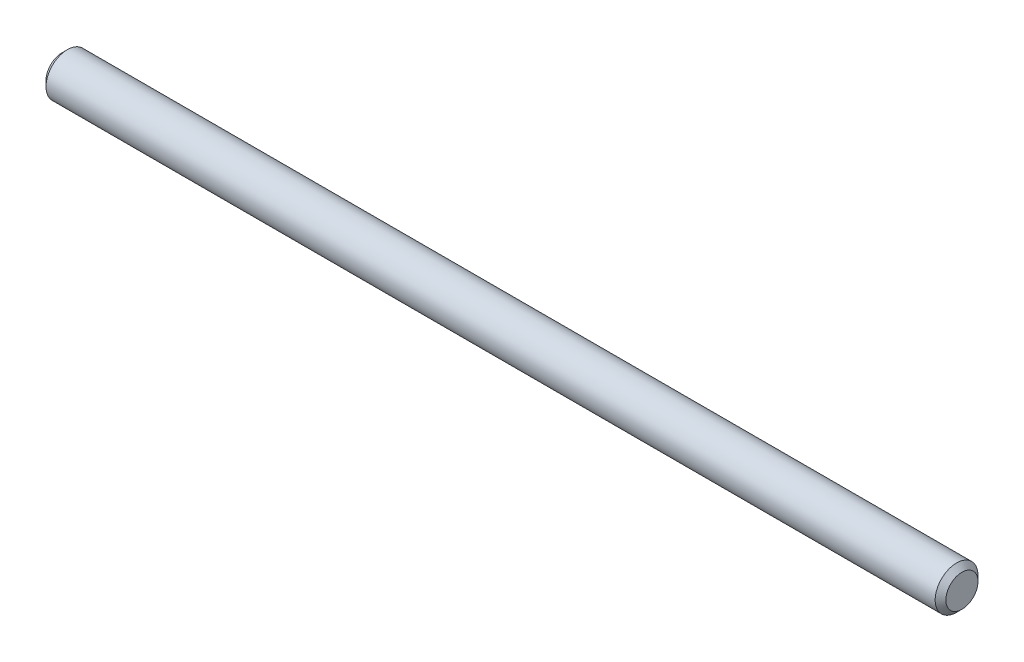
ISO-10303-21;
HEADER;
FILE_DESCRIPTION(('STEP AP214'),'2;1');
FILE_NAME('part.step','',(''),(''),'','','');
FILE_SCHEMA(('AUTOMOTIVE_DESIGN { 1 0 10303 214 1 1 1 1 }'));
ENDSEC;
DATA;
#1=APPLICATION_CONTEXT('core data for automotive mechanical design processes');
#2=APPLICATION_PROTOCOL_DEFINITION('international standard','automotive_design',2000,#1);
#3=PRODUCT_CONTEXT('',#1,'mechanical');
#4=PRODUCT('Part','Part','',(#3));
#5=PRODUCT_RELATED_PRODUCT_CATEGORY('part','',(#4));
#6=PRODUCT_DEFINITION_FORMATION('','',#4);
#7=PRODUCT_DEFINITION_CONTEXT('part definition',#1,'design');
#8=PRODUCT_DEFINITION('design','',#6,#7);
#9=PRODUCT_DEFINITION_SHAPE('','',#8);
#10=(LENGTH_UNIT() NAMED_UNIT(*) SI_UNIT(.MILLI.,.METRE.));
#11=(NAMED_UNIT(*) PLANE_ANGLE_UNIT() SI_UNIT($,.RADIAN.));
#12=(NAMED_UNIT(*) SI_UNIT($,.STERADIAN.) SOLID_ANGLE_UNIT());
#13=UNCERTAINTY_MEASURE_WITH_UNIT(LENGTH_MEASURE(1.E-05),#10,'distance_accuracy_value','');
#14=(GEOMETRIC_REPRESENTATION_CONTEXT(3) GLOBAL_UNCERTAINTY_ASSIGNED_CONTEXT((#13)) GLOBAL_UNIT_ASSIGNED_CONTEXT((#10,
#11,#12)) REPRESENTATION_CONTEXT('',''));
#15=CARTESIAN_POINT('',(0.,0.,0.));
#16=DIRECTION('',(0.,0.,1.));
#17=DIRECTION('',(1.,0.,0.));
#18=AXIS2_PLACEMENT_3D('',#15,#16,#17);
#19=CARTESIAN_POINT('',(42.,0.,0.));
#20=DIRECTION('',(-1.,0.,0.));
#21=DIRECTION('',(0.,0.,1.));
#22=AXIS2_PLACEMENT_3D('',#19,#20,#21);
#23=CYLINDRICAL_SURFACE('',#22,2.);
#24=CARTESIAN_POINT('',(41.5,0.,0.));
#25=DIRECTION('',(1.,0.,0.));
#26=DIRECTION('',(0.,0.,-1.));
#27=AXIS2_PLACEMENT_3D('',#24,#25,#26);
#28=CIRCLE('',#27,2.);
#29=CARTESIAN_POINT('',(41.5,0.,2.));
#30=VERTEX_POINT('',#29);
#31=EDGE_CURVE('E42',#30,#30,#28,.F.);
#32=CARTESIAN_POINT('',(-41.4999999999999,0.,0.));
#33=DIRECTION('',(1.,0.,0.));
#34=DIRECTION('',(0.,0.,-1.));
#35=AXIS2_PLACEMENT_3D('',#32,#33,#34);
#36=CIRCLE('',#35,2.);
#37=CARTESIAN_POINT('',(-41.4999999999999,0.,2.));
#38=VERTEX_POINT('',#37);
#39=EDGE_CURVE('E46',#38,#38,#36,.T.);
#40=CARTESIAN_POINT('',(41.5,0.,2.));
#41=CARTESIAN_POINT('',(40.6354166666667,0.,2.));
#42=CARTESIAN_POINT('',(39.7708333333334,0.,2.));
#43=CARTESIAN_POINT('',(38.0416666666667,0.,2.));
#44=CARTESIAN_POINT('',(37.1770833333334,0.,2.));
#45=CARTESIAN_POINT('',(35.4479166666667,0.,2.));
#46=CARTESIAN_POINT('',(34.5833333333334,0.,2.));
#47=CARTESIAN_POINT('',(32.8541666666667,0.,2.));
#48=CARTESIAN_POINT('',(31.9895833333334,0.,2.));
#49=CARTESIAN_POINT('',(30.2604166666667,0.,2.));
#50=CARTESIAN_POINT('',(29.3958333333334,0.,2.));
#51=CARTESIAN_POINT('',(27.6666666666667,0.,2.));
#52=CARTESIAN_POINT('',(26.8020833333334,0.,2.));
#53=CARTESIAN_POINT('',(25.0729166666667,0.,2.));
#54=CARTESIAN_POINT('',(24.2083333333334,0.,2.));
#55=CARTESIAN_POINT('',(22.4791666666667,0.,2.));
#56=CARTESIAN_POINT('',(21.6145833333334,0.,2.));
#57=CARTESIAN_POINT('',(19.8854166666667,0.,2.));
#58=CARTESIAN_POINT('',(19.0208333333334,0.,2.));
#59=CARTESIAN_POINT('',(17.2916666666667,0.,2.));
#60=CARTESIAN_POINT('',(16.4270833333334,0.,2.));
#61=CARTESIAN_POINT('',(14.6979166666667,0.,2.));
#62=CARTESIAN_POINT('',(13.8333333333334,0.,2.));
#63=CARTESIAN_POINT('',(12.1041666666667,0.,2.));
#64=CARTESIAN_POINT('',(11.2395833333334,0.,2.));
#65=CARTESIAN_POINT('',(9.5104166666667,0.,2.));
#66=CARTESIAN_POINT('',(8.64583333333337,0.,2.));
#67=CARTESIAN_POINT('',(6.9166666666667,0.,2.));
#68=CARTESIAN_POINT('',(6.05208333333337,0.,2.));
#69=CARTESIAN_POINT('',(4.3229166666667,0.,2.));
#70=CARTESIAN_POINT('',(3.45833333333337,0.,2.));
#71=CARTESIAN_POINT('',(1.7291666666667,0.,2.));
#72=CARTESIAN_POINT('',(0.864583333333372,0.,2.));
#73=CARTESIAN_POINT('',(-0.864583333333294,0.,2.));
#74=CARTESIAN_POINT('',(-1.72916666666663,0.,2.));
#75=CARTESIAN_POINT('',(-3.45833333333329,0.,2.));
#76=CARTESIAN_POINT('',(-4.32291666666663,0.,2.));
#77=CARTESIAN_POINT('',(-6.05208333333329,0.,2.));
#78=CARTESIAN_POINT('',(-6.91666666666663,0.,2.));
#79=CARTESIAN_POINT('',(-8.64583333333329,0.,2.));
#80=CARTESIAN_POINT('',(-9.51041666666662,0.,2.));
#81=CARTESIAN_POINT('',(-11.2395833333333,0.,2.));
#82=CARTESIAN_POINT('',(-12.1041666666666,0.,2.));
#83=CARTESIAN_POINT('',(-13.8333333333333,0.,2.));
#84=CARTESIAN_POINT('',(-14.6979166666666,0.,2.));
#85=CARTESIAN_POINT('',(-16.4270833333333,0.,2.));
#86=CARTESIAN_POINT('',(-17.2916666666666,0.,2.));
#87=CARTESIAN_POINT('',(-19.0208333333333,0.,2.));
#88=CARTESIAN_POINT('',(-19.8854166666666,0.,2.));
#89=CARTESIAN_POINT('',(-21.6145833333333,0.,2.));
#90=CARTESIAN_POINT('',(-22.4791666666666,0.,2.));
#91=CARTESIAN_POINT('',(-24.2083333333333,0.,2.));
#92=CARTESIAN_POINT('',(-25.0729166666666,0.,2.));
#93=CARTESIAN_POINT('',(-26.8020833333333,0.,2.));
#94=CARTESIAN_POINT('',(-27.6666666666666,0.,2.));
#95=CARTESIAN_POINT('',(-29.3958333333333,0.,2.));
#96=CARTESIAN_POINT('',(-30.2604166666666,0.,2.));
#97=CARTESIAN_POINT('',(-31.9895833333333,0.,2.));
#98=CARTESIAN_POINT('',(-32.8541666666666,0.,2.));
#99=CARTESIAN_POINT('',(-34.5833333333333,0.,2.));
#100=CARTESIAN_POINT('',(-35.4479166666666,0.,2.));
#101=CARTESIAN_POINT('',(-37.1770833333333,0.,2.));
#102=CARTESIAN_POINT('',(-38.0416666666666,0.,2.));
#103=CARTESIAN_POINT('',(-39.7708333333333,0.,2.));
#104=CARTESIAN_POINT('',(-40.6354166666666,0.,2.));
#105=CARTESIAN_POINT('',(-41.4999999999999,0.,2.));
#106=B_SPLINE_CURVE_WITH_KNOTS('',3,(#40,#41,#42,#43,#44,#45,#46,#47,#48,#49,#50,#51,#52,#53,
#54,#55,#56,#57,#58,#59,#60,#61,#62,#63,#64,#65,#66,#67,#68,#69,#70,#71,#72,#73,#74,#75,#76,#77,
#78,#79,#80,#81,#82,#83,#84,#85,#86,#87,#88,#89,#90,#91,#92,#93,#94,#95,#96,#97,#98,#99,#100,
#101,#102,#103,#104,#105),.UNSPECIFIED.,.F.,.F.,(4,2,2,2,2,2,2,2,2,2,2,2,2,2,2,2,2,2,2,2,2,2,2,
2,2,2,2,2,2,2,2,2,4),(0.,2.59375000000001,5.1875,7.78125,10.375,12.96875,15.5625,18.15625,20.75,
23.34375,25.9375,28.53125,31.125,33.71875,36.3125,38.90625,41.5,44.09375,46.6875,49.28125,
51.875,54.46875,57.0625,59.65625,62.25,64.84375,67.4375,70.03125,72.625,75.21875,77.8125,
80.40625,83.),.UNSPECIFIED.);
#107=EDGE_CURVE('BSEAM35',#30,#38,#106,.T.);
#108=ORIENTED_EDGE('',*,*,#31,.T.);
#109=ORIENTED_EDGE('',*,*,#39,.T.);
#110=ORIENTED_EDGE('',*,*,#107,.T.);
#111=ORIENTED_EDGE('',*,*,#107,.F.);
#112=EDGE_LOOP('',(#108,#110,#109,#111));
#113=FACE_BOUND('',#112,.T.);
#114=ADVANCED_FACE('F35',(#113),#23,.T.);
#115=CARTESIAN_POINT('',(42.,0.,0.));
#116=DIRECTION('',(1.,0.,0.));
#117=DIRECTION('',(0.,0.,-1.));
#118=AXIS2_PLACEMENT_3D('',#115,#116,#117);
#119=PLANE('',#118);
#120=CARTESIAN_POINT('',(42.,0.,0.));
#121=DIRECTION('',(1.,0.,0.));
#122=DIRECTION('',(0.,0.,-1.));
#123=AXIS2_PLACEMENT_3D('',#120,#121,#122);
#124=CIRCLE('',#123,1.50000000000003);
#125=CARTESIAN_POINT('',(42.,0.,-1.50000000000003));
#126=VERTEX_POINT('',#125);
#127=EDGE_CURVE('E50',#126,#126,#124,.T.);
#128=ORIENTED_EDGE('',*,*,#127,.T.);
#129=EDGE_LOOP('',(#128));
#130=FACE_BOUND('',#129,.T.);
#131=ADVANCED_FACE('F56',(#130),#119,.T.);
#132=CARTESIAN_POINT('',(-42.,0.,0.));
#133=DIRECTION('',(1.,0.,0.));
#134=DIRECTION('',(0.,0.,-1.));
#135=AXIS2_PLACEMENT_3D('',#132,#133,#134);
#136=PLANE('',#135);
#137=CARTESIAN_POINT('',(-42.,0.,0.));
#138=DIRECTION('',(1.,0.,0.));
#139=DIRECTION('',(0.,0.,-1.));
#140=AXIS2_PLACEMENT_3D('',#137,#138,#139);
#141=CIRCLE('',#140,1.49999999999992);
#142=CARTESIAN_POINT('',(-42.,0.,-1.49999999999992));
#143=VERTEX_POINT('',#142);
#144=EDGE_CURVE('E10',#143,#143,#141,.F.);
#145=ORIENTED_EDGE('',*,*,#144,.T.);
#146=EDGE_LOOP('',(#145));
#147=FACE_BOUND('',#146,.T.);
#148=ADVANCED_FACE('F60',(#147),#136,.F.);
#149=CARTESIAN_POINT('',(42.,0.,0.));
#150=DIRECTION('',(-1.,0.,0.));
#151=DIRECTION('',(0.,0.,1.));
#152=AXIS2_PLACEMENT_3D('',#149,#150,#151);
#153=CONICAL_SURFACE('',#152,1.50000000000003,0.785398163397449);
#154=ORIENTED_EDGE('',*,*,#31,.F.);
#155=EDGE_LOOP('',(#154));
#156=FACE_BOUND('',#155,.T.);
#157=ORIENTED_EDGE('',*,*,#127,.F.);
#158=EDGE_LOOP('',(#157));
#159=FACE_BOUND('',#158,.T.);
#160=ADVANCED_FACE('F58',(#156,#159),#153,.T.);
#161=CARTESIAN_POINT('',(-41.4999999999999,0.,0.));
#162=DIRECTION('',(1.,0.,0.));
#163=DIRECTION('',(0.,0.,-1.));
#164=AXIS2_PLACEMENT_3D('',#161,#162,#163);
#165=CONICAL_SURFACE('',#164,2.,0.785398163397456);
#166=ORIENTED_EDGE('',*,*,#144,.F.);
#167=EDGE_LOOP('',(#166));
#168=FACE_BOUND('',#167,.T.);
#169=ORIENTED_EDGE('',*,*,#39,.F.);
#170=EDGE_LOOP('',(#169));
#171=FACE_BOUND('',#170,.T.);
#172=ADVANCED_FACE('F37',(#168,#171),#165,.T.);
#173=CLOSED_SHELL('',(#114,#131,#148,#160,#172));
#174=MANIFOLD_SOLID_BREP('B2',#173);
#175=ADVANCED_BREP_SHAPE_REPRESENTATION('',(#18,#174),#14);
#176=SHAPE_DEFINITION_REPRESENTATION(#9,#175);
ENDSEC;
END-ISO-10303-21;
